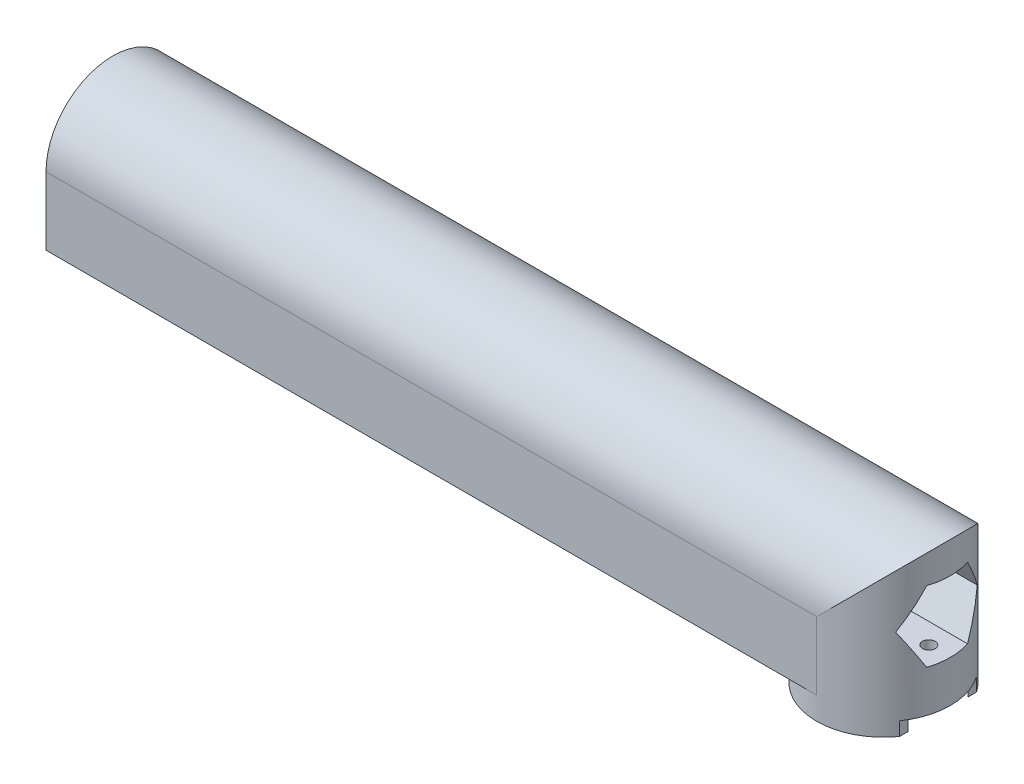
ISO-10303-21;
HEADER;
FILE_DESCRIPTION(('STEP AP214'),'2;1');
FILE_NAME('part.step','',(''),(''),'','','');
FILE_SCHEMA(('AUTOMOTIVE_DESIGN { 1 0 10303 214 1 1 1 1 }'));
ENDSEC;
DATA;
#1=APPLICATION_CONTEXT('core data for automotive mechanical design processes');
#2=APPLICATION_PROTOCOL_DEFINITION('international standard','automotive_design',2000,#1);
#3=PRODUCT_CONTEXT('',#1,'mechanical');
#4=PRODUCT('Part','Part','',(#3));
#5=PRODUCT_RELATED_PRODUCT_CATEGORY('part','',(#4));
#6=PRODUCT_DEFINITION_FORMATION('','',#4);
#7=PRODUCT_DEFINITION_CONTEXT('part definition',#1,'design');
#8=PRODUCT_DEFINITION('design','',#6,#7);
#9=PRODUCT_DEFINITION_SHAPE('','',#8);
#10=(LENGTH_UNIT() NAMED_UNIT(*) SI_UNIT(.MILLI.,.METRE.));
#11=(NAMED_UNIT(*) PLANE_ANGLE_UNIT() SI_UNIT($,.RADIAN.));
#12=(NAMED_UNIT(*) SI_UNIT($,.STERADIAN.) SOLID_ANGLE_UNIT());
#13=UNCERTAINTY_MEASURE_WITH_UNIT(LENGTH_MEASURE(1.E-05),#10,'distance_accuracy_value','');
#14=(GEOMETRIC_REPRESENTATION_CONTEXT(3) GLOBAL_UNCERTAINTY_ASSIGNED_CONTEXT((#13)) GLOBAL_UNIT_ASSIGNED_CONTEXT((#10,
#11,#12)) REPRESENTATION_CONTEXT('',''));
#15=CARTESIAN_POINT('',(0.,0.,0.));
#16=DIRECTION('',(0.,0.,1.));
#17=DIRECTION('',(1.,0.,0.));
#18=AXIS2_PLACEMENT_3D('',#15,#16,#17);
#19=CARTESIAN_POINT('',(0.,5.,0.));
#20=DIRECTION('',(0.,-1.,0.));
#21=DIRECTION('',(0.,0.,-1.));
#22=AXIS2_PLACEMENT_3D('',#19,#20,#21);
#23=CYLINDRICAL_SURFACE('',#22,14.75);
#24=DIRECTION('',(0.,1.,0.));
#25=VECTOR('',#24,1.);
#26=CARTESIAN_POINT('',(0.,5.,-14.75));
#27=LINE('',#26,#25);
#28=CARTESIAN_POINT('',(0.,5.,-14.75));
#29=VERTEX_POINT('',#28);
#30=CARTESIAN_POINT('',(0.,20.,-14.75));
#31=VERTEX_POINT('',#30);
#32=EDGE_CURVE('E240',#29,#31,#27,.T.);
#33=ORIENTED_EDGE('',*,*,#32,.T.);
#34=CARTESIAN_POINT('',(0.,20.,0.));
#35=DIRECTION('',(0.707106781186547,-0.707106781186547,0.));
#36=DIRECTION('',(-0.707106781186547,-0.707106781186547,0.));
#37=AXIS2_PLACEMENT_3D('',#34,#35,#36);
#38=ELLIPSE('',#37,20.8596500450032,14.75);
#39=CARTESIAN_POINT('',(0.,20.,14.75));
#40=VERTEX_POINT('',#39);
#41=EDGE_CURVE('E234',#31,#40,#38,.T.);
#42=ORIENTED_EDGE('',*,*,#41,.T.);
#43=DIRECTION('',(0.,1.,0.));
#44=VECTOR('',#43,1.);
#45=CARTESIAN_POINT('',(0.,5.,14.75));
#46=LINE('',#45,#44);
#47=CARTESIAN_POINT('',(0.,5.,14.75));
#48=VERTEX_POINT('',#47);
#49=EDGE_CURVE('E239',#48,#40,#46,.T.);
#50=ORIENTED_EDGE('',*,*,#49,.F.);
#51=CARTESIAN_POINT('',(0.,5.,0.));
#52=DIRECTION('',(0.,1.,0.));
#53=DIRECTION('',(0.,0.,-1.));
#54=AXIS2_PLACEMENT_3D('',#51,#52,#53);
#55=CIRCLE('',#54,14.75);
#56=EDGE_CURVE('E237',#29,#48,#55,.T.);
#57=ORIENTED_EDGE('',*,*,#56,.F.);
#58=EDGE_LOOP('',(#33,#42,#50,#57));
#59=FACE_BOUND('',#58,.T.);
#60=CARTESIAN_POINT('',(0.,3.,0.));
#61=DIRECTION('',(0.,-1.,0.));
#62=DIRECTION('',(0.,0.,-1.));
#63=AXIS2_PLACEMENT_3D('',#60,#61,#62);
#64=CIRCLE('',#63,14.75);
#65=CARTESIAN_POINT('',(-12.0545634512412,3.,8.5));
#66=VERTEX_POINT('',#65);
#67=CARTESIAN_POINT('',(-12.0545634512412,3.,-8.5));
#68=VERTEX_POINT('',#67);
#69=EDGE_CURVE('E246',#66,#68,#64,.T.);
#70=ORIENTED_EDGE('',*,*,#69,.F.);
#71=DIRECTION('',(0.,-1.,0.));
#72=VECTOR('',#71,1.);
#73=CARTESIAN_POINT('',(-12.0545634512412,3.,8.5));
#74=LINE('',#73,#72);
#75=CARTESIAN_POINT('',(-12.0545634512412,0.,8.5));
#76=VERTEX_POINT('',#75);
#77=EDGE_CURVE('E254',#66,#76,#74,.T.);
#78=ORIENTED_EDGE('',*,*,#77,.T.);
#79=CARTESIAN_POINT('',(0.,0.,0.));
#80=DIRECTION('',(0.,1.,0.));
#81=DIRECTION('',(0.,0.,1.));
#82=AXIS2_PLACEMENT_3D('',#79,#80,#81);
#83=CIRCLE('',#82,14.75);
#84=CARTESIAN_POINT('',(12.0545634512412,0.,8.5));
#85=VERTEX_POINT('',#84);
#86=EDGE_CURVE('E44',#76,#85,#83,.T.);
#87=ORIENTED_EDGE('',*,*,#86,.T.);
#88=DIRECTION('',(0.,-1.,0.));
#89=VECTOR('',#88,1.);
#90=CARTESIAN_POINT('',(12.0545634512412,3.,8.5));
#91=LINE('',#90,#89);
#92=CARTESIAN_POINT('',(12.0545634512412,3.,8.5));
#93=VERTEX_POINT('',#92);
#94=EDGE_CURVE('E265',#93,#85,#91,.T.);
#95=ORIENTED_EDGE('',*,*,#94,.F.);
#96=CARTESIAN_POINT('',(0.,3.,0.));
#97=DIRECTION('',(0.,-1.,0.));
#98=DIRECTION('',(0.,0.,1.));
#99=AXIS2_PLACEMENT_3D('',#96,#97,#98);
#100=CIRCLE('',#99,14.75);
#101=CARTESIAN_POINT('',(12.0545634512412,3.,-8.5));
#102=VERTEX_POINT('',#101);
#103=EDGE_CURVE('E259',#102,#93,#100,.T.);
#104=ORIENTED_EDGE('',*,*,#103,.F.);
#105=DIRECTION('',(0.,-1.,0.));
#106=VECTOR('',#105,1.);
#107=CARTESIAN_POINT('',(12.0545634512412,3.,-8.5));
#108=LINE('',#107,#106);
#109=CARTESIAN_POINT('',(12.0545634512412,0.,-8.5));
#110=VERTEX_POINT('',#109);
#111=EDGE_CURVE('E267',#102,#110,#108,.T.);
#112=ORIENTED_EDGE('',*,*,#111,.T.);
#113=CARTESIAN_POINT('',(-12.0545634512412,0.,-8.5));
#114=VERTEX_POINT('',#113);
#115=EDGE_CURVE('E11',#110,#114,#83,.T.);
#116=ORIENTED_EDGE('',*,*,#115,.T.);
#117=DIRECTION('',(0.,-1.,0.));
#118=VECTOR('',#117,1.);
#119=CARTESIAN_POINT('',(-12.0545634512412,3.,-8.5));
#120=LINE('',#119,#118);
#121=EDGE_CURVE('E251',#68,#114,#120,.T.);
#122=ORIENTED_EDGE('',*,*,#121,.F.);
#123=EDGE_LOOP('',(#70,#78,#87,#95,#104,#112,#116,#122));
#124=FACE_BOUND('',#123,.T.);
#125=CARTESIAN_POINT('',(0.,27.7942286340599,0.));
#126=DIRECTION('',(0.,-1.,0.));
#127=DIRECTION('',(0.,0.,-1.));
#128=AXIS2_PLACEMENT_3D('',#125,#126,#127);
#129=CIRCLE('',#128,14.75);
#130=CARTESIAN_POINT('',(14.0467967878801,27.7942286340599,-4.5));
#131=VERTEX_POINT('',#130);
#132=CARTESIAN_POINT('',(14.0467967878801,27.7942286340599,4.5));
#133=VERTEX_POINT('',#132);
#134=EDGE_CURVE('E198',#131,#133,#129,.T.);
#135=ORIENTED_EDGE('',*,*,#134,.F.);
#136=CARTESIAN_POINT('',(0.,35.5884572681199,0.));
#137=DIRECTION('',(0.,-0.5,0.866025403784439));
#138=DIRECTION('',(0.,-0.866025403784439,-0.5));
#139=AXIS2_PLACEMENT_3D('',#136,#137,#138);
#140=ELLIPSE('',#139,29.5,14.75);
#141=CARTESIAN_POINT('',(11.6859958925202,20.,-9.));
#142=VERTEX_POINT('',#141);
#143=EDGE_CURVE('E172',#142,#131,#140,.T.);
#144=ORIENTED_EDGE('',*,*,#143,.F.);
#145=CARTESIAN_POINT('',(0.,4.41154273188011,0.));
#146=DIRECTION('',(0.,0.5,0.866025403784439));
#147=DIRECTION('',(0.,-0.866025403784439,0.5));
#148=AXIS2_PLACEMENT_3D('',#145,#146,#147);
#149=ELLIPSE('',#148,29.5,14.75);
#150=CARTESIAN_POINT('',(14.0467967878801,12.2057713659401,-4.5));
#151=VERTEX_POINT('',#150);
#152=EDGE_CURVE('E207',#151,#142,#149,.T.);
#153=ORIENTED_EDGE('',*,*,#152,.F.);
#154=CARTESIAN_POINT('',(0.,12.2057713659401,0.));
#155=DIRECTION('',(0.,1.,0.));
#156=DIRECTION('',(0.,0.,1.));
#157=AXIS2_PLACEMENT_3D('',#154,#155,#156);
#158=CIRCLE('',#157,14.75);
#159=CARTESIAN_POINT('',(14.0467967878801,12.2057713659401,4.5));
#160=VERTEX_POINT('',#159);
#161=EDGE_CURVE('E209',#160,#151,#158,.T.);
#162=ORIENTED_EDGE('',*,*,#161,.F.);
#163=CARTESIAN_POINT('',(0.,4.41154273188009,0.));
#164=DIRECTION('',(0.,0.5,-0.866025403784439));
#165=DIRECTION('',(0.,-0.866025403784439,-0.5));
#166=AXIS2_PLACEMENT_3D('',#163,#164,#165);
#167=ELLIPSE('',#166,29.5,14.75);
#168=CARTESIAN_POINT('',(11.6859958925202,20.,9.));
#169=VERTEX_POINT('',#168);
#170=EDGE_CURVE('E211',#169,#160,#167,.T.);
#171=ORIENTED_EDGE('',*,*,#170,.F.);
#172=CARTESIAN_POINT('',(0.,35.5884572681199,0.));
#173=DIRECTION('',(0.,-0.5,-0.866025403784439));
#174=DIRECTION('',(0.,-0.866025403784439,0.5));
#175=AXIS2_PLACEMENT_3D('',#172,#173,#174);
#176=ELLIPSE('',#175,29.5,14.75);
#177=EDGE_CURVE('E213',#133,#169,#176,.T.);
#178=ORIENTED_EDGE('',*,*,#177,.F.);
#179=EDGE_LOOP('',(#135,#144,#153,#162,#171,#178));
#180=FACE_BOUND('',#179,.T.);
#181=ADVANCED_FACE('F36',(#59,#124,#180),#23,.T.);
#182=CARTESIAN_POINT('',(-170.,20.,0.));
#183=DIRECTION('',(1.,0.,0.));
#184=DIRECTION('',(0.,0.,-1.));
#185=AXIS2_PLACEMENT_3D('',#182,#183,#184);
#186=PLANE('',#185);
#187=CARTESIAN_POINT('',(-170.,20.,0.));
#188=DIRECTION('',(-1.,0.,0.));
#189=DIRECTION('',(0.,0.,-1.));
#190=AXIS2_PLACEMENT_3D('',#187,#188,#189);
#191=CIRCLE('',#190,14.75);
#192=CARTESIAN_POINT('',(-170.,20.,14.75));
#193=VERTEX_POINT('',#192);
#194=CARTESIAN_POINT('',(-170.,20.,-14.75));
#195=VERTEX_POINT('',#194);
#196=EDGE_CURVE('E215',#193,#195,#191,.T.);
#197=ORIENTED_EDGE('',*,*,#196,.T.);
#198=DIRECTION('',(0.,-1.,0.));
#199=VECTOR('',#198,1.);
#200=CARTESIAN_POINT('',(-170.,20.,-14.75));
#201=LINE('',#200,#199);
#202=CARTESIAN_POINT('',(-170.,5.,-14.75));
#203=VERTEX_POINT('',#202);
#204=EDGE_CURVE('E218',#195,#203,#201,.T.);
#205=ORIENTED_EDGE('',*,*,#204,.T.);
#206=DIRECTION('',(0.,0.,1.));
#207=VECTOR('',#206,1.);
#208=CARTESIAN_POINT('',(-170.,5.,-14.75));
#209=LINE('',#208,#207);
#210=CARTESIAN_POINT('',(-170.,5.,14.75));
#211=VERTEX_POINT('',#210);
#212=EDGE_CURVE('E220',#203,#211,#209,.T.);
#213=ORIENTED_EDGE('',*,*,#212,.T.);
#214=DIRECTION('',(0.,1.,0.));
#215=VECTOR('',#214,1.);
#216=CARTESIAN_POINT('',(-170.,5.,14.75));
#217=LINE('',#216,#215);
#218=EDGE_CURVE('E222',#211,#193,#217,.T.);
#219=ORIENTED_EDGE('',*,*,#218,.T.);
#220=EDGE_LOOP('',(#197,#205,#213,#219));
#221=FACE_BOUND('',#220,.T.);
#222=DIRECTION('',(0.,-0.866025403784439,0.5));
#223=VECTOR('',#222,1.);
#224=CARTESIAN_POINT('',(-170.,8.89711431702997,15.4102540378444));
#225=LINE('',#224,#223);
#226=CARTESIAN_POINT('',(-170.,27.7942286340599,4.5));
#227=VERTEX_POINT('',#226);
#228=CARTESIAN_POINT('',(-170.,20.,9.));
#229=VERTEX_POINT('',#228);
#230=EDGE_CURVE('E52',#227,#229,#225,.T.);
#231=ORIENTED_EDGE('',*,*,#230,.T.);
#232=DIRECTION('',(0.,-0.866025403784439,-0.5));
#233=VECTOR('',#232,1.);
#234=CARTESIAN_POINT('',(-170.,1.10288568297002,-1.91025403784438));
#235=LINE('',#234,#233);
#236=CARTESIAN_POINT('',(-170.,12.2057713659401,4.5));
#237=VERTEX_POINT('',#236);
#238=EDGE_CURVE('E193',#229,#237,#235,.T.);
#239=ORIENTED_EDGE('',*,*,#238,.T.);
#240=DIRECTION('',(0.,0.,-1.));
#241=VECTOR('',#240,1.);
#242=CARTESIAN_POINT('',(-170.,12.2057713659401,0.));
#243=LINE('',#242,#241);
#244=CARTESIAN_POINT('',(-170.,12.2057713659401,-4.5));
#245=VERTEX_POINT('',#244);
#246=EDGE_CURVE('E188',#237,#245,#243,.T.);
#247=ORIENTED_EDGE('',*,*,#246,.T.);
#248=DIRECTION('',(0.,0.866025403784439,-0.5));
#249=VECTOR('',#248,1.);
#250=CARTESIAN_POINT('',(-170.,1.10288568297003,1.91025403784439));
#251=LINE('',#250,#249);
#252=CARTESIAN_POINT('',(-170.,20.,-9.));
#253=VERTEX_POINT('',#252);
#254=EDGE_CURVE('E186',#245,#253,#251,.T.);
#255=ORIENTED_EDGE('',*,*,#254,.T.);
#256=DIRECTION('',(0.,0.866025403784439,0.5));
#257=VECTOR('',#256,1.);
#258=CARTESIAN_POINT('',(-170.,8.89711431702997,-15.4102540378444));
#259=LINE('',#258,#257);
#260=CARTESIAN_POINT('',(-170.,27.7942286340599,-4.5));
#261=VERTEX_POINT('',#260);
#262=EDGE_CURVE('E169',#253,#261,#259,.T.);
#263=ORIENTED_EDGE('',*,*,#262,.T.);
#264=DIRECTION('',(0.,0.,1.));
#265=VECTOR('',#264,1.);
#266=CARTESIAN_POINT('',(-170.,27.7942286340599,0.));
#267=LINE('',#266,#265);
#268=EDGE_CURVE('E179',#261,#227,#267,.T.);
#269=ORIENTED_EDGE('',*,*,#268,.T.);
#270=EDGE_LOOP('',(#231,#239,#247,#255,#263,#269));
#271=FACE_BOUND('',#270,.T.);
#272=ADVANCED_FACE('F183',(#221,#271),#186,.F.);
#273=CARTESIAN_POINT('',(0.,0.,0.));
#274=DIRECTION('',(0.,1.,0.));
#275=DIRECTION('',(0.,0.,1.));
#276=AXIS2_PLACEMENT_3D('',#273,#274,#275);
#277=PLANE('',#276);
#278=ORIENTED_EDGE('',*,*,#86,.F.);
#279=DIRECTION('',(0.,0.,1.));
#280=VECTOR('',#279,1.);
#281=CARTESIAN_POINT('',(-12.0545634512412,0.,8.5));
#282=LINE('',#281,#280);
#283=CARTESIAN_POINT('',(-12.0545634512412,0.,6.61437827766148));
#284=VERTEX_POINT('',#283);
#285=EDGE_CURVE('E253',#284,#76,#282,.T.);
#286=ORIENTED_EDGE('',*,*,#285,.F.);
#287=CARTESIAN_POINT('',(0.,0.,0.));
#288=DIRECTION('',(0.,-1.,0.));
#289=DIRECTION('',(0.,0.,-1.));
#290=AXIS2_PLACEMENT_3D('',#287,#288,#289);
#291=CIRCLE('',#290,13.75);
#292=CARTESIAN_POINT('',(12.0545634512412,0.,6.61437827766148));
#293=VERTEX_POINT('',#292);
#294=EDGE_CURVE('E286',#293,#284,#291,.T.);
#295=ORIENTED_EDGE('',*,*,#294,.F.);
#296=DIRECTION('',(0.,0.,-1.));
#297=VECTOR('',#296,1.);
#298=CARTESIAN_POINT('',(12.0545634512412,0.,8.5));
#299=LINE('',#298,#297);
#300=EDGE_CURVE('E262',#85,#293,#299,.T.);
#301=ORIENTED_EDGE('',*,*,#300,.F.);
#302=EDGE_LOOP('',(#278,#286,#295,#301));
#303=FACE_BOUND('',#302,.T.);
#304=ADVANCED_FACE('F373',(#303),#277,.F.);
#305=CARTESIAN_POINT('',(0.,3.,0.));
#306=DIRECTION('',(0.,-1.,0.));
#307=DIRECTION('',(0.,0.,-1.));
#308=AXIS2_PLACEMENT_3D('',#305,#306,#307);
#309=CYLINDRICAL_SURFACE('',#308,13.75);
#310=ORIENTED_EDGE('',*,*,#294,.T.);
#311=DIRECTION('',(0.,-1.,0.));
#312=VECTOR('',#311,1.);
#313=CARTESIAN_POINT('',(-12.0545634512412,3.,6.61437827766148));
#314=LINE('',#313,#312);
#315=CARTESIAN_POINT('',(-12.0545634512412,3.,6.61437827766148));
#316=VERTEX_POINT('',#315);
#317=EDGE_CURVE('E279',#284,#316,#314,.F.);
#318=ORIENTED_EDGE('',*,*,#317,.T.);
#319=CARTESIAN_POINT('',(0.,3.,0.));
#320=DIRECTION('',(0.,-1.,0.));
#321=DIRECTION('',(0.,0.,-1.));
#322=AXIS2_PLACEMENT_3D('',#319,#320,#321);
#323=CIRCLE('',#322,13.75);
#324=CARTESIAN_POINT('',(12.0545634512412,3.,6.61437827766148));
#325=VERTEX_POINT('',#324);
#326=EDGE_CURVE('E285',#325,#316,#323,.T.);
#327=ORIENTED_EDGE('',*,*,#326,.F.);
#328=DIRECTION('',(0.,-1.,0.));
#329=VECTOR('',#328,1.);
#330=CARTESIAN_POINT('',(12.0545634512412,3.,6.61437827766148));
#331=LINE('',#330,#329);
#332=EDGE_CURVE('E257',#325,#293,#331,.T.);
#333=ORIENTED_EDGE('',*,*,#332,.T.);
#334=EDGE_LOOP('',(#310,#318,#327,#333));
#335=FACE_BOUND('',#334,.T.);
#336=ADVANCED_FACE('F407',(#335),#309,.F.);
#337=CARTESIAN_POINT('',(-12.0545634512412,0.,-6.61437827766148));
#338=VERTEX_POINT('',#337);
#339=CARTESIAN_POINT('',(12.0545634512412,0.,-6.61437827766148));
#340=VERTEX_POINT('',#339);
#341=EDGE_CURVE('E282',#338,#340,#291,.T.);
#342=ORIENTED_EDGE('',*,*,#341,.F.);
#343=EDGE_CURVE('E249',#114,#338,#282,.T.);
#344=ORIENTED_EDGE('',*,*,#343,.F.);
#345=ORIENTED_EDGE('',*,*,#115,.F.);
#346=EDGE_CURVE('E243',#340,#110,#299,.T.);
#347=ORIENTED_EDGE('',*,*,#346,.F.);
#348=EDGE_LOOP('',(#342,#344,#345,#347));
#349=FACE_BOUND('',#348,.T.);
#350=ADVANCED_FACE('F427',(#349),#277,.F.);
#351=CARTESIAN_POINT('',(-12.0545634512412,3.,-6.61437827766148));
#352=VERTEX_POINT('',#351);
#353=CARTESIAN_POINT('',(12.0545634512412,3.,-6.61437827766147));
#354=VERTEX_POINT('',#353);
#355=EDGE_CURVE('E283',#352,#354,#323,.T.);
#356=ORIENTED_EDGE('',*,*,#355,.F.);
#357=DIRECTION('',(0.,-1.,0.));
#358=VECTOR('',#357,1.);
#359=CARTESIAN_POINT('',(-12.0545634512412,3.,-6.61437827766148));
#360=LINE('',#359,#358);
#361=EDGE_CURVE('E276',#352,#338,#360,.T.);
#362=ORIENTED_EDGE('',*,*,#361,.T.);
#363=ORIENTED_EDGE('',*,*,#341,.T.);
#364=DIRECTION('',(0.,-1.,0.));
#365=VECTOR('',#364,1.);
#366=CARTESIAN_POINT('',(12.0545634512412,3.,-6.61437827766148));
#367=LINE('',#366,#365);
#368=EDGE_CURVE('E273',#340,#354,#367,.F.);
#369=ORIENTED_EDGE('',*,*,#368,.T.);
#370=EDGE_LOOP('',(#356,#362,#363,#369));
#371=FACE_BOUND('',#370,.T.);
#372=ADVANCED_FACE('F389',(#371),#309,.F.);
#373=CARTESIAN_POINT('',(0.,3.,0.));
#374=DIRECTION('',(0.,-1.,0.));
#375=DIRECTION('',(0.,0.,-1.));
#376=AXIS2_PLACEMENT_3D('',#373,#374,#375);
#377=PLANE('',#376);
#378=CARTESIAN_POINT('',(0.,3.,10.));
#379=DIRECTION('',(0.,-1.,0.));
#380=DIRECTION('',(0.,0.,-1.));
#381=AXIS2_PLACEMENT_3D('',#378,#379,#380);
#382=CIRCLE('',#381,1.4);
#383=CARTESIAN_POINT('',(0.,3.,8.6));
#384=VERTEX_POINT('',#383);
#385=EDGE_CURVE('E296',#384,#384,#382,.T.);
#386=ORIENTED_EDGE('',*,*,#385,.F.);
#387=EDGE_LOOP('',(#386));
#388=FACE_BOUND('',#387,.T.);
#389=CARTESIAN_POINT('',(7.07106781186548,3.,7.07106781186548));
#390=DIRECTION('',(0.,-1.,0.));
#391=DIRECTION('',(0.,0.,-1.));
#392=AXIS2_PLACEMENT_3D('',#389,#390,#391);
#393=CIRCLE('',#392,1.4);
#394=CARTESIAN_POINT('',(7.07106781186548,3.,5.67106781186548));
#395=VERTEX_POINT('',#394);
#396=EDGE_CURVE('E306',#395,#395,#393,.T.);
#397=ORIENTED_EDGE('',*,*,#396,.F.);
#398=EDGE_LOOP('',(#397));
#399=FACE_BOUND('',#398,.T.);
#400=CARTESIAN_POINT('',(10.,3.,0.));
#401=DIRECTION('',(0.,-1.,0.));
#402=DIRECTION('',(0.,0.,-1.));
#403=AXIS2_PLACEMENT_3D('',#400,#401,#402);
#404=CIRCLE('',#403,1.4);
#405=CARTESIAN_POINT('',(10.,3.,-1.4));
#406=VERTEX_POINT('',#405);
#407=EDGE_CURVE('E309',#406,#406,#404,.T.);
#408=ORIENTED_EDGE('',*,*,#407,.F.);
#409=EDGE_LOOP('',(#408));
#410=FACE_BOUND('',#409,.T.);
#411=CARTESIAN_POINT('',(7.07106781186548,3.,-7.07106781186548));
#412=DIRECTION('',(0.,-1.,0.));
#413=DIRECTION('',(0.,0.,-1.));
#414=AXIS2_PLACEMENT_3D('',#411,#412,#413);
#415=CIRCLE('',#414,1.4);
#416=CARTESIAN_POINT('',(7.07106781186548,3.,-8.47106781186548));
#417=VERTEX_POINT('',#416);
#418=EDGE_CURVE('E315',#417,#417,#415,.T.);
#419=ORIENTED_EDGE('',*,*,#418,.F.);
#420=EDGE_LOOP('',(#419));
#421=FACE_BOUND('',#420,.T.);
#422=CARTESIAN_POINT('',(0.,3.,-10.));
#423=DIRECTION('',(0.,-1.,0.));
#424=DIRECTION('',(0.,0.,-1.));
#425=AXIS2_PLACEMENT_3D('',#422,#423,#424);
#426=CIRCLE('',#425,1.4);
#427=CARTESIAN_POINT('',(0.,3.,-11.4));
#428=VERTEX_POINT('',#427);
#429=EDGE_CURVE('E321',#428,#428,#426,.T.);
#430=ORIENTED_EDGE('',*,*,#429,.F.);
#431=EDGE_LOOP('',(#430));
#432=FACE_BOUND('',#431,.T.);
#433=CARTESIAN_POINT('',(-7.07106781186548,3.,-7.07106781186548));
#434=DIRECTION('',(0.,-1.,0.));
#435=DIRECTION('',(0.,0.,-1.));
#436=AXIS2_PLACEMENT_3D('',#433,#434,#435);
#437=CIRCLE('',#436,1.4);
#438=CARTESIAN_POINT('',(-7.07106781186548,3.,-8.47106781186548));
#439=VERTEX_POINT('',#438);
#440=EDGE_CURVE('E327',#439,#439,#437,.T.);
#441=ORIENTED_EDGE('',*,*,#440,.F.);
#442=EDGE_LOOP('',(#441));
#443=FACE_BOUND('',#442,.T.);
#444=CARTESIAN_POINT('',(-10.,3.,0.));
#445=DIRECTION('',(0.,-1.,0.));
#446=DIRECTION('',(0.,0.,-1.));
#447=AXIS2_PLACEMENT_3D('',#444,#445,#446);
#448=CIRCLE('',#447,1.4);
#449=CARTESIAN_POINT('',(-10.,3.,-1.4));
#450=VERTEX_POINT('',#449);
#451=EDGE_CURVE('E330',#450,#450,#448,.T.);
#452=ORIENTED_EDGE('',*,*,#451,.F.);
#453=EDGE_LOOP('',(#452));
#454=FACE_BOUND('',#453,.T.);
#455=CARTESIAN_POINT('',(-7.07106781186548,3.,7.07106781186547));
#456=DIRECTION('',(0.,-1.,0.));
#457=DIRECTION('',(0.,0.,-1.));
#458=AXIS2_PLACEMENT_3D('',#455,#456,#457);
#459=CIRCLE('',#458,1.4);
#460=CARTESIAN_POINT('',(-7.07106781186548,3.,5.67106781186547));
#461=VERTEX_POINT('',#460);
#462=EDGE_CURVE('E336',#461,#461,#459,.T.);
#463=ORIENTED_EDGE('',*,*,#462,.F.);
#464=EDGE_LOOP('',(#463));
#465=FACE_BOUND('',#464,.T.);
#466=ORIENTED_EDGE('',*,*,#326,.T.);
#467=DIRECTION('',(0.,0.,1.));
#468=VECTOR('',#467,1.);
#469=CARTESIAN_POINT('',(-12.0545634512412,3.,8.5));
#470=LINE('',#469,#468);
#471=EDGE_CURVE('E248',#316,#66,#470,.T.);
#472=ORIENTED_EDGE('',*,*,#471,.T.);
#473=ORIENTED_EDGE('',*,*,#69,.T.);
#474=EDGE_CURVE('E60',#68,#352,#470,.T.);
#475=ORIENTED_EDGE('',*,*,#474,.T.);
#476=ORIENTED_EDGE('',*,*,#355,.T.);
#477=DIRECTION('',(0.,0.,-1.));
#478=VECTOR('',#477,1.);
#479=CARTESIAN_POINT('',(12.0545634512412,3.,8.5));
#480=LINE('',#479,#478);
#481=EDGE_CURVE('E261',#354,#102,#480,.T.);
#482=ORIENTED_EDGE('',*,*,#481,.T.);
#483=ORIENTED_EDGE('',*,*,#103,.T.);
#484=EDGE_CURVE('E263',#93,#325,#480,.T.);
#485=ORIENTED_EDGE('',*,*,#484,.T.);
#486=EDGE_LOOP('',(#466,#472,#473,#475,#476,#482,#483,#485));
#487=FACE_BOUND('',#486,.T.);
#488=ADVANCED_FACE('F382',(#388,#399,#410,#421,#432,#443,#454,#465,#487),#377,.T.);
#489=CARTESIAN_POINT('',(12.0545634512412,3.,8.5));
#490=DIRECTION('',(-1.,0.,0.));
#491=DIRECTION('',(0.,0.,1.));
#492=AXIS2_PLACEMENT_3D('',#489,#490,#491);
#493=PLANE('',#492);
#494=ORIENTED_EDGE('',*,*,#346,.T.);
#495=ORIENTED_EDGE('',*,*,#111,.F.);
#496=ORIENTED_EDGE('',*,*,#481,.F.);
#497=ORIENTED_EDGE('',*,*,#368,.F.);
#498=EDGE_LOOP('',(#494,#495,#496,#497));
#499=FACE_BOUND('',#498,.T.);
#500=ADVANCED_FACE('F394',(#499),#493,.F.);
#501=ORIENTED_EDGE('',*,*,#484,.F.);
#502=ORIENTED_EDGE('',*,*,#94,.T.);
#503=ORIENTED_EDGE('',*,*,#300,.T.);
#504=ORIENTED_EDGE('',*,*,#332,.F.);
#505=EDGE_LOOP('',(#501,#502,#503,#504));
#506=FACE_BOUND('',#505,.T.);
#507=ADVANCED_FACE('F400',(#506),#493,.F.);
#508=CARTESIAN_POINT('',(-12.0545634512412,3.,8.5));
#509=DIRECTION('',(1.,0.,0.));
#510=DIRECTION('',(0.,0.,-1.));
#511=AXIS2_PLACEMENT_3D('',#508,#509,#510);
#512=PLANE('',#511);
#513=ORIENTED_EDGE('',*,*,#285,.T.);
#514=ORIENTED_EDGE('',*,*,#77,.F.);
#515=ORIENTED_EDGE('',*,*,#471,.F.);
#516=ORIENTED_EDGE('',*,*,#317,.F.);
#517=EDGE_LOOP('',(#513,#514,#515,#516));
#518=FACE_BOUND('',#517,.T.);
#519=ADVANCED_FACE('F410',(#518),#512,.F.);
#520=ORIENTED_EDGE('',*,*,#474,.F.);
#521=ORIENTED_EDGE('',*,*,#121,.T.);
#522=ORIENTED_EDGE('',*,*,#343,.T.);
#523=ORIENTED_EDGE('',*,*,#361,.F.);
#524=EDGE_LOOP('',(#520,#521,#522,#523));
#525=FACE_BOUND('',#524,.T.);
#526=ADVANCED_FACE('F384',(#525),#512,.F.);
#527=CARTESIAN_POINT('',(15.,20.,0.));
#528=DIRECTION('',(-1.,0.,0.));
#529=DIRECTION('',(0.,0.,1.));
#530=AXIS2_PLACEMENT_3D('',#527,#528,#529);
#531=CYLINDRICAL_SURFACE('',#530,14.75);
#532=ORIENTED_EDGE('',*,*,#41,.F.);
#533=DIRECTION('',(1.,0.,0.));
#534=VECTOR('',#533,1.);
#535=CARTESIAN_POINT('',(-170.,20.,-14.75));
#536=LINE('',#535,#534);
#537=EDGE_CURVE('E232',#195,#31,#536,.T.);
#538=ORIENTED_EDGE('',*,*,#537,.F.);
#539=ORIENTED_EDGE('',*,*,#196,.F.);
#540=DIRECTION('',(1.,0.,0.));
#541=VECTOR('',#540,1.);
#542=CARTESIAN_POINT('',(-170.,20.,14.75));
#543=LINE('',#542,#541);
#544=EDGE_CURVE('E224',#193,#40,#543,.T.);
#545=ORIENTED_EDGE('',*,*,#544,.T.);
#546=EDGE_LOOP('',(#532,#538,#539,#545));
#547=FACE_BOUND('',#546,.T.);
#548=ADVANCED_FACE('F417',(#547),#531,.T.);
#549=CARTESIAN_POINT('',(-170.,5.,-14.75));
#550=DIRECTION('',(0.,1.,0.));
#551=DIRECTION('',(0.,0.,1.));
#552=AXIS2_PLACEMENT_3D('',#549,#550,#551);
#553=PLANE('',#552);
#554=DIRECTION('',(1.,0.,0.));
#555=VECTOR('',#554,1.);
#556=CARTESIAN_POINT('',(-170.,5.,-14.75));
#557=LINE('',#556,#555);
#558=EDGE_CURVE('E229',#203,#29,#557,.T.);
#559=ORIENTED_EDGE('',*,*,#558,.T.);
#560=ORIENTED_EDGE('',*,*,#56,.T.);
#561=DIRECTION('',(1.,0.,0.));
#562=VECTOR('',#561,1.);
#563=CARTESIAN_POINT('',(-170.,5.,14.75));
#564=LINE('',#563,#562);
#565=EDGE_CURVE('E226',#211,#48,#564,.T.);
#566=ORIENTED_EDGE('',*,*,#565,.F.);
#567=ORIENTED_EDGE('',*,*,#212,.F.);
#568=EDGE_LOOP('',(#559,#560,#566,#567));
#569=FACE_BOUND('',#568,.T.);
#570=ADVANCED_FACE('F486',(#569),#553,.F.);
#571=CARTESIAN_POINT('',(-170.,20.,-14.75));
#572=DIRECTION('',(0.,0.,1.));
#573=DIRECTION('',(1.,0.,0.));
#574=AXIS2_PLACEMENT_3D('',#571,#572,#573);
#575=PLANE('',#574);
#576=ORIENTED_EDGE('',*,*,#32,.F.);
#577=ORIENTED_EDGE('',*,*,#558,.F.);
#578=ORIENTED_EDGE('',*,*,#204,.F.);
#579=ORIENTED_EDGE('',*,*,#537,.T.);
#580=EDGE_LOOP('',(#576,#577,#578,#579));
#581=FACE_BOUND('',#580,.T.);
#582=ADVANCED_FACE('F363',(#581),#575,.F.);
#583=CARTESIAN_POINT('',(-170.,5.,14.75));
#584=DIRECTION('',(0.,0.,-1.));
#585=DIRECTION('',(0.,1.,0.));
#586=AXIS2_PLACEMENT_3D('',#583,#584,#585);
#587=PLANE('',#586);
#588=ORIENTED_EDGE('',*,*,#49,.T.);
#589=ORIENTED_EDGE('',*,*,#544,.F.);
#590=ORIENTED_EDGE('',*,*,#218,.F.);
#591=ORIENTED_EDGE('',*,*,#565,.T.);
#592=EDGE_LOOP('',(#588,#589,#590,#591));
#593=FACE_BOUND('',#592,.T.);
#594=ADVANCED_FACE('F356',(#593),#587,.F.);
#595=CARTESIAN_POINT('',(14.75,8.89711431702997,15.4102540378444));
#596=DIRECTION('',(0.,-0.5,-0.866025403784439));
#597=DIRECTION('',(0.,0.866025403784439,-0.5));
#598=AXIS2_PLACEMENT_3D('',#595,#596,#597);
#599=PLANE('',#598);
#600=ORIENTED_EDGE('',*,*,#177,.T.);
#601=DIRECTION('',(-1.,0.,0.));
#602=VECTOR('',#601,1.);
#603=CARTESIAN_POINT('',(14.75,20.,9.));
#604=LINE('',#603,#602);
#605=EDGE_CURVE('E196',#169,#229,#604,.T.);
#606=ORIENTED_EDGE('',*,*,#605,.T.);
#607=ORIENTED_EDGE('',*,*,#230,.F.);
#608=DIRECTION('',(-1.,0.,0.));
#609=VECTOR('',#608,1.);
#610=CARTESIAN_POINT('',(14.75,27.7942286340599,4.5));
#611=LINE('',#610,#609);
#612=EDGE_CURVE('E176',#133,#227,#611,.T.);
#613=ORIENTED_EDGE('',*,*,#612,.F.);
#614=EDGE_LOOP('',(#600,#606,#607,#613));
#615=FACE_BOUND('',#614,.T.);
#616=ADVANCED_FACE('F354',(#615),#599,.T.);
#617=CARTESIAN_POINT('',(14.75,1.10288568297002,-1.91025403784438));
#618=DIRECTION('',(0.,0.5,-0.866025403784439));
#619=DIRECTION('',(0.,0.866025403784439,0.5));
#620=AXIS2_PLACEMENT_3D('',#617,#618,#619);
#621=PLANE('',#620);
#622=ORIENTED_EDGE('',*,*,#170,.T.);
#623=DIRECTION('',(-1.,0.,0.));
#624=VECTOR('',#623,1.);
#625=CARTESIAN_POINT('',(14.75,12.2057713659401,4.5));
#626=LINE('',#625,#624);
#627=EDGE_CURVE('E199',#160,#237,#626,.T.);
#628=ORIENTED_EDGE('',*,*,#627,.T.);
#629=ORIENTED_EDGE('',*,*,#238,.F.);
#630=ORIENTED_EDGE('',*,*,#605,.F.);
#631=EDGE_LOOP('',(#622,#628,#629,#630));
#632=FACE_BOUND('',#631,.T.);
#633=ADVANCED_FACE('F342',(#632),#621,.T.);
#634=CARTESIAN_POINT('',(14.75,12.2057713659401,0.));
#635=DIRECTION('',(0.,1.,0.));
#636=DIRECTION('',(0.,0.,1.));
#637=AXIS2_PLACEMENT_3D('',#634,#635,#636);
#638=PLANE('',#637);
#639=CARTESIAN_POINT('',(10.,12.2057713659401,0.));
#640=DIRECTION('',(0.,1.,0.));
#641=DIRECTION('',(0.,0.,1.));
#642=AXIS2_PLACEMENT_3D('',#639,#640,#641);
#643=CIRCLE('',#642,1.4);
#644=CARTESIAN_POINT('',(10.,12.2057713659401,1.4));
#645=VERTEX_POINT('',#644);
#646=EDGE_CURVE('E39',#645,#645,#643,.T.);
#647=ORIENTED_EDGE('',*,*,#646,.F.);
#648=EDGE_LOOP('',(#647));
#649=FACE_BOUND('',#648,.T.);
#650=CARTESIAN_POINT('',(-10.,12.2057713659401,0.));
#651=DIRECTION('',(0.,1.,0.));
#652=DIRECTION('',(0.,0.,1.));
#653=AXIS2_PLACEMENT_3D('',#650,#651,#652);
#654=CIRCLE('',#653,1.4);
#655=CARTESIAN_POINT('',(-10.,12.2057713659401,1.4));
#656=VERTEX_POINT('',#655);
#657=EDGE_CURVE('E289',#656,#656,#654,.T.);
#658=ORIENTED_EDGE('',*,*,#657,.F.);
#659=EDGE_LOOP('',(#658));
#660=FACE_BOUND('',#659,.T.);
#661=ORIENTED_EDGE('',*,*,#161,.T.);
#662=DIRECTION('',(-1.,0.,0.));
#663=VECTOR('',#662,1.);
#664=CARTESIAN_POINT('',(14.75,12.2057713659401,-4.5));
#665=LINE('',#664,#663);
#666=EDGE_CURVE('E201',#151,#245,#665,.T.);
#667=ORIENTED_EDGE('',*,*,#666,.T.);
#668=ORIENTED_EDGE('',*,*,#246,.F.);
#669=ORIENTED_EDGE('',*,*,#627,.F.);
#670=EDGE_LOOP('',(#661,#667,#668,#669));
#671=FACE_BOUND('',#670,.T.);
#672=ADVANCED_FACE('F347',(#649,#660,#671),#638,.T.);
#673=CARTESIAN_POINT('',(14.75,1.10288568297003,1.91025403784439));
#674=DIRECTION('',(0.,0.5,0.866025403784439));
#675=DIRECTION('',(0.,-0.866025403784439,0.5));
#676=AXIS2_PLACEMENT_3D('',#673,#674,#675);
#677=PLANE('',#676);
#678=ORIENTED_EDGE('',*,*,#152,.T.);
#679=DIRECTION('',(-1.,0.,0.));
#680=VECTOR('',#679,1.);
#681=CARTESIAN_POINT('',(14.75,20.,-9.));
#682=LINE('',#681,#680);
#683=EDGE_CURVE('E175',#142,#253,#682,.T.);
#684=ORIENTED_EDGE('',*,*,#683,.T.);
#685=ORIENTED_EDGE('',*,*,#254,.F.);
#686=ORIENTED_EDGE('',*,*,#666,.F.);
#687=EDGE_LOOP('',(#678,#684,#685,#686));
#688=FACE_BOUND('',#687,.T.);
#689=ADVANCED_FACE('F351',(#688),#677,.T.);
#690=CARTESIAN_POINT('',(14.75,8.89711431702997,-15.4102540378444));
#691=DIRECTION('',(0.,-0.5,0.866025403784439));
#692=DIRECTION('',(0.,-0.866025403784439,-0.5));
#693=AXIS2_PLACEMENT_3D('',#690,#691,#692);
#694=PLANE('',#693);
#695=ORIENTED_EDGE('',*,*,#143,.T.);
#696=DIRECTION('',(-1.,0.,0.));
#697=VECTOR('',#696,1.);
#698=CARTESIAN_POINT('',(14.75,27.7942286340599,-4.5));
#699=LINE('',#698,#697);
#700=EDGE_CURVE('E164',#131,#261,#699,.T.);
#701=ORIENTED_EDGE('',*,*,#700,.T.);
#702=ORIENTED_EDGE('',*,*,#262,.F.);
#703=ORIENTED_EDGE('',*,*,#683,.F.);
#704=EDGE_LOOP('',(#695,#701,#702,#703));
#705=FACE_BOUND('',#704,.T.);
#706=ADVANCED_FACE('F166',(#705),#694,.T.);
#707=CARTESIAN_POINT('',(14.75,27.7942286340599,0.));
#708=DIRECTION('',(0.,-1.,0.));
#709=DIRECTION('',(0.,0.,-1.));
#710=AXIS2_PLACEMENT_3D('',#707,#708,#709);
#711=PLANE('',#710);
#712=ORIENTED_EDGE('',*,*,#134,.T.);
#713=ORIENTED_EDGE('',*,*,#612,.T.);
#714=ORIENTED_EDGE('',*,*,#268,.F.);
#715=ORIENTED_EDGE('',*,*,#700,.F.);
#716=EDGE_LOOP('',(#712,#713,#714,#715));
#717=FACE_BOUND('',#716,.T.);
#718=ADVANCED_FACE('F180',(#717),#711,.T.);
#719=CARTESIAN_POINT('',(-10.,13.,0.));
#720=DIRECTION('',(0.,-1.,0.));
#721=DIRECTION('',(0.,0.,-1.));
#722=AXIS2_PLACEMENT_3D('',#719,#720,#721);
#723=CYLINDRICAL_SURFACE('',#722,1.4);
#724=ORIENTED_EDGE('',*,*,#657,.T.);
#725=EDGE_LOOP('',(#724));
#726=FACE_BOUND('',#725,.T.);
#727=ORIENTED_EDGE('',*,*,#451,.T.);
#728=EDGE_LOOP('',(#727));
#729=FACE_BOUND('',#728,.T.);
#730=ADVANCED_FACE('F555',(#726,#729),#723,.F.);
#731=CARTESIAN_POINT('',(10.,13.,0.));
#732=DIRECTION('',(0.,-1.,0.));
#733=DIRECTION('',(0.,0.,-1.));
#734=AXIS2_PLACEMENT_3D('',#731,#732,#733);
#735=CYLINDRICAL_SURFACE('',#734,1.4);
#736=ORIENTED_EDGE('',*,*,#646,.T.);
#737=EDGE_LOOP('',(#736));
#738=FACE_BOUND('',#737,.T.);
#739=ORIENTED_EDGE('',*,*,#407,.T.);
#740=EDGE_LOOP('',(#739));
#741=FACE_BOUND('',#740,.T.);
#742=ADVANCED_FACE('F575',(#738,#741),#735,.F.);
#743=CARTESIAN_POINT('',(-7.07106781186548,13.,7.07106781186547));
#744=DIRECTION('',(0.,-1.,0.));
#745=DIRECTION('',(0.,0.,-1.));
#746=AXIS2_PLACEMENT_3D('',#743,#744,#745);
#747=CYLINDRICAL_SURFACE('',#746,1.4);
#748=CARTESIAN_POINT('',(-7.07106781186548,13.,7.07106781186547));
#749=DIRECTION('',(0.,-1.,0.));
#750=DIRECTION('',(0.,0.,-1.));
#751=AXIS2_PLACEMENT_3D('',#748,#749,#750);
#752=CIRCLE('',#751,1.4);
#753=CARTESIAN_POINT('',(-7.07106781186548,13.,5.67106781186547));
#754=VERTEX_POINT('',#753);
#755=EDGE_CURVE('E333',#754,#754,#752,.T.);
#756=ORIENTED_EDGE('',*,*,#755,.F.);
#757=EDGE_LOOP('',(#756));
#758=FACE_BOUND('',#757,.T.);
#759=ORIENTED_EDGE('',*,*,#462,.T.);
#760=EDGE_LOOP('',(#759));
#761=FACE_BOUND('',#760,.T.);
#762=ADVANCED_FACE('F584',(#758,#761),#747,.F.);
#763=CARTESIAN_POINT('',(-7.07106781186548,13.,7.07106781186547));
#764=DIRECTION('',(0.,-1.,0.));
#765=DIRECTION('',(0.,0.,-1.));
#766=AXIS2_PLACEMENT_3D('',#763,#764,#765);
#767=PLANE('',#766);
#768=ORIENTED_EDGE('',*,*,#755,.T.);
#769=EDGE_LOOP('',(#768));
#770=FACE_BOUND('',#769,.T.);
#771=ADVANCED_FACE('F594',(#770),#767,.T.);
#772=CARTESIAN_POINT('',(-7.07106781186548,13.,-7.07106781186548));
#773=DIRECTION('',(0.,-1.,0.));
#774=DIRECTION('',(0.,0.,-1.));
#775=AXIS2_PLACEMENT_3D('',#772,#773,#774);
#776=CYLINDRICAL_SURFACE('',#775,1.4);
#777=CARTESIAN_POINT('',(-7.07106781186548,13.,-7.07106781186548));
#778=DIRECTION('',(0.,-1.,0.));
#779=DIRECTION('',(0.,0.,-1.));
#780=AXIS2_PLACEMENT_3D('',#777,#778,#779);
#781=CIRCLE('',#780,1.4);
#782=CARTESIAN_POINT('',(-7.07106781186548,13.,-8.47106781186548));
#783=VERTEX_POINT('',#782);
#784=EDGE_CURVE('E324',#783,#783,#781,.T.);
#785=ORIENTED_EDGE('',*,*,#784,.F.);
#786=EDGE_LOOP('',(#785));
#787=FACE_BOUND('',#786,.T.);
#788=ORIENTED_EDGE('',*,*,#440,.T.);
#789=EDGE_LOOP('',(#788));
#790=FACE_BOUND('',#789,.T.);
#791=ADVANCED_FACE('F604',(#787,#790),#776,.F.);
#792=CARTESIAN_POINT('',(-7.07106781186548,13.,-7.07106781186548));
#793=DIRECTION('',(0.,-1.,0.));
#794=DIRECTION('',(0.,0.,-1.));
#795=AXIS2_PLACEMENT_3D('',#792,#793,#794);
#796=PLANE('',#795);
#797=ORIENTED_EDGE('',*,*,#784,.T.);
#798=EDGE_LOOP('',(#797));
#799=FACE_BOUND('',#798,.T.);
#800=ADVANCED_FACE('F614',(#799),#796,.T.);
#801=CARTESIAN_POINT('',(0.,13.,-10.));
#802=DIRECTION('',(0.,-1.,0.));
#803=DIRECTION('',(0.,0.,-1.));
#804=AXIS2_PLACEMENT_3D('',#801,#802,#803);
#805=CYLINDRICAL_SURFACE('',#804,1.4);
#806=CARTESIAN_POINT('',(0.,13.,-10.));
#807=DIRECTION('',(0.,-1.,0.));
#808=DIRECTION('',(0.,0.,-1.));
#809=AXIS2_PLACEMENT_3D('',#806,#807,#808);
#810=CIRCLE('',#809,1.4);
#811=CARTESIAN_POINT('',(0.,13.,-11.4));
#812=VERTEX_POINT('',#811);
#813=EDGE_CURVE('E318',#812,#812,#810,.T.);
#814=ORIENTED_EDGE('',*,*,#813,.F.);
#815=EDGE_LOOP('',(#814));
#816=FACE_BOUND('',#815,.T.);
#817=ORIENTED_EDGE('',*,*,#429,.T.);
#818=EDGE_LOOP('',(#817));
#819=FACE_BOUND('',#818,.T.);
#820=ADVANCED_FACE('F624',(#816,#819),#805,.F.);
#821=CARTESIAN_POINT('',(0.,13.,-10.));
#822=DIRECTION('',(0.,-1.,0.));
#823=DIRECTION('',(0.,0.,-1.));
#824=AXIS2_PLACEMENT_3D('',#821,#822,#823);
#825=PLANE('',#824);
#826=ORIENTED_EDGE('',*,*,#813,.T.);
#827=EDGE_LOOP('',(#826));
#828=FACE_BOUND('',#827,.T.);
#829=ADVANCED_FACE('F634',(#828),#825,.T.);
#830=CARTESIAN_POINT('',(7.07106781186548,13.,-7.07106781186548));
#831=DIRECTION('',(0.,-1.,0.));
#832=DIRECTION('',(0.,0.,-1.));
#833=AXIS2_PLACEMENT_3D('',#830,#831,#832);
#834=CYLINDRICAL_SURFACE('',#833,1.4);
#835=CARTESIAN_POINT('',(7.07106781186548,13.,-7.07106781186548));
#836=DIRECTION('',(0.,-1.,0.));
#837=DIRECTION('',(0.,0.,-1.));
#838=AXIS2_PLACEMENT_3D('',#835,#836,#837);
#839=CIRCLE('',#838,1.4);
#840=CARTESIAN_POINT('',(7.07106781186548,13.,-8.47106781186548));
#841=VERTEX_POINT('',#840);
#842=EDGE_CURVE('E312',#841,#841,#839,.T.);
#843=ORIENTED_EDGE('',*,*,#842,.F.);
#844=EDGE_LOOP('',(#843));
#845=FACE_BOUND('',#844,.T.);
#846=ORIENTED_EDGE('',*,*,#418,.T.);
#847=EDGE_LOOP('',(#846));
#848=FACE_BOUND('',#847,.T.);
#849=ADVANCED_FACE('F644',(#845,#848),#834,.F.);
#850=CARTESIAN_POINT('',(7.07106781186548,13.,-7.07106781186548));
#851=DIRECTION('',(0.,-1.,0.));
#852=DIRECTION('',(0.,0.,-1.));
#853=AXIS2_PLACEMENT_3D('',#850,#851,#852);
#854=PLANE('',#853);
#855=ORIENTED_EDGE('',*,*,#842,.T.);
#856=EDGE_LOOP('',(#855));
#857=FACE_BOUND('',#856,.T.);
#858=ADVANCED_FACE('F654',(#857),#854,.T.);
#859=CARTESIAN_POINT('',(7.07106781186548,13.,7.07106781186548));
#860=DIRECTION('',(0.,-1.,0.));
#861=DIRECTION('',(0.,0.,-1.));
#862=AXIS2_PLACEMENT_3D('',#859,#860,#861);
#863=CYLINDRICAL_SURFACE('',#862,1.4);
#864=CARTESIAN_POINT('',(7.07106781186548,13.,7.07106781186548));
#865=DIRECTION('',(0.,-1.,0.));
#866=DIRECTION('',(0.,0.,-1.));
#867=AXIS2_PLACEMENT_3D('',#864,#865,#866);
#868=CIRCLE('',#867,1.4);
#869=CARTESIAN_POINT('',(7.07106781186548,13.,5.67106781186548));
#870=VERTEX_POINT('',#869);
#871=EDGE_CURVE('E301',#870,#870,#868,.T.);
#872=ORIENTED_EDGE('',*,*,#871,.F.);
#873=EDGE_LOOP('',(#872));
#874=FACE_BOUND('',#873,.T.);
#875=ORIENTED_EDGE('',*,*,#396,.T.);
#876=EDGE_LOOP('',(#875));
#877=FACE_BOUND('',#876,.T.);
#878=ADVANCED_FACE('F664',(#874,#877),#863,.F.);
#879=CARTESIAN_POINT('',(7.07106781186548,13.,7.07106781186548));
#880=DIRECTION('',(0.,-1.,0.));
#881=DIRECTION('',(0.,0.,-1.));
#882=AXIS2_PLACEMENT_3D('',#879,#880,#881);
#883=PLANE('',#882);
#884=ORIENTED_EDGE('',*,*,#871,.T.);
#885=EDGE_LOOP('',(#884));
#886=FACE_BOUND('',#885,.T.);
#887=ADVANCED_FACE('F674',(#886),#883,.T.);
#888=CARTESIAN_POINT('',(0.,13.,10.));
#889=DIRECTION('',(0.,-1.,0.));
#890=DIRECTION('',(0.,0.,-1.));
#891=AXIS2_PLACEMENT_3D('',#888,#889,#890);
#892=CYLINDRICAL_SURFACE('',#891,1.4);
#893=CARTESIAN_POINT('',(0.,13.,10.));
#894=DIRECTION('',(0.,-1.,0.));
#895=DIRECTION('',(0.,0.,-1.));
#896=AXIS2_PLACEMENT_3D('',#893,#894,#895);
#897=CIRCLE('',#896,1.4);
#898=CARTESIAN_POINT('',(0.,13.,8.6));
#899=VERTEX_POINT('',#898);
#900=EDGE_CURVE('E291',#899,#899,#897,.T.);
#901=ORIENTED_EDGE('',*,*,#900,.F.);
#902=EDGE_LOOP('',(#901));
#903=FACE_BOUND('',#902,.T.);
#904=ORIENTED_EDGE('',*,*,#385,.T.);
#905=EDGE_LOOP('',(#904));
#906=FACE_BOUND('',#905,.T.);
#907=ADVANCED_FACE('F684',(#903,#906),#892,.F.);
#908=CARTESIAN_POINT('',(0.,13.,10.));
#909=DIRECTION('',(0.,-1.,0.));
#910=DIRECTION('',(0.,0.,-1.));
#911=AXIS2_PLACEMENT_3D('',#908,#909,#910);
#912=PLANE('',#911);
#913=ORIENTED_EDGE('',*,*,#900,.T.);
#914=EDGE_LOOP('',(#913));
#915=FACE_BOUND('',#914,.T.);
#916=ADVANCED_FACE('F694',(#915),#912,.T.);
#917=CLOSED_SHELL('',(#181,#272,#304,#336,#350,#372,#488,#500,#507,#519,#526,#548,#570,#582,
#594,#616,#633,#672,#689,#706,#718,#730,#742,#762,#771,#791,#800,#820,#829,#849,#858,#878,#887,
#907,#916));
#918=MANIFOLD_SOLID_BREP('B2',#917);
#919=ADVANCED_BREP_SHAPE_REPRESENTATION('',(#18,#918),#14);
#920=SHAPE_DEFINITION_REPRESENTATION(#9,#919);
ENDSEC;
END-ISO-10303-21;
